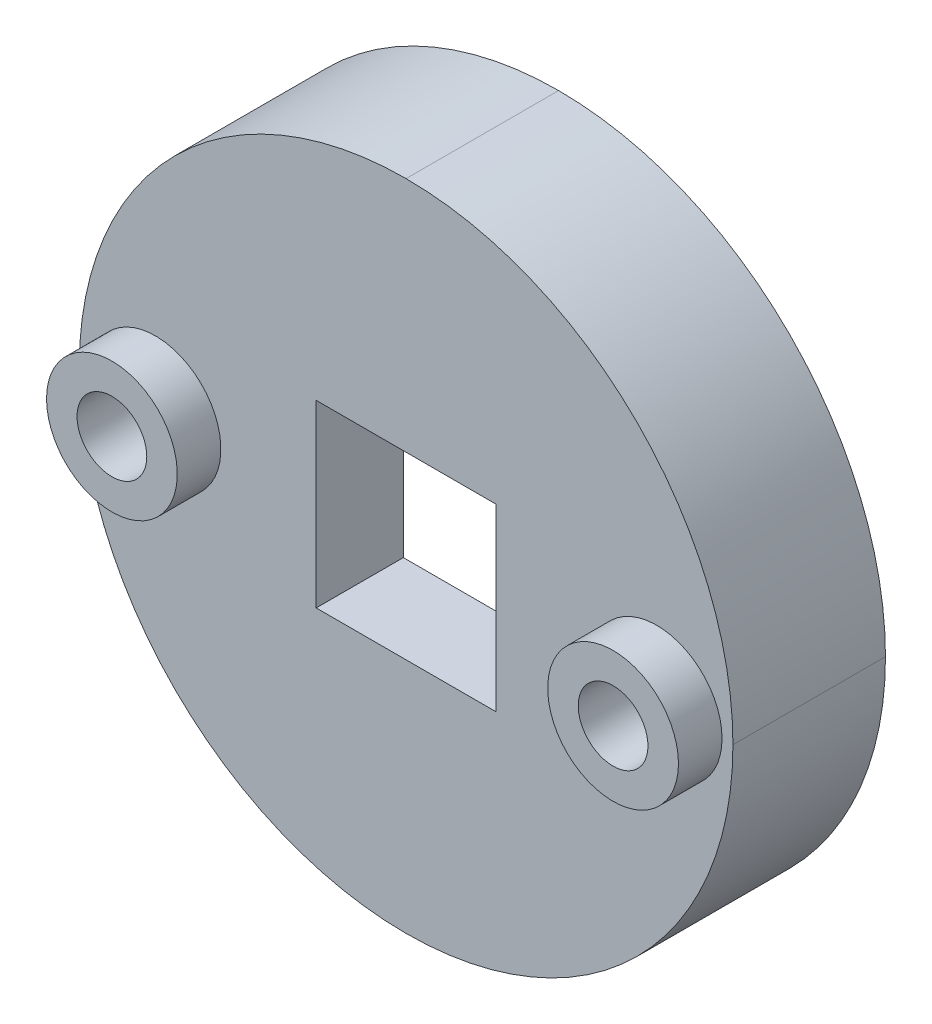
ISO-10303-21;
HEADER;
FILE_DESCRIPTION(('STEP AP214'),'2;1');
FILE_NAME('part.step','',(''),(''),'','','');
FILE_SCHEMA(('AUTOMOTIVE_DESIGN { 1 0 10303 214 1 1 1 1 }'));
ENDSEC;
DATA;
#1=APPLICATION_CONTEXT('core data for automotive mechanical design processes');
#2=APPLICATION_PROTOCOL_DEFINITION('international standard','automotive_design',2000,#1);
#3=PRODUCT_CONTEXT('',#1,'mechanical');
#4=PRODUCT('Part','Part','',(#3));
#5=PRODUCT_RELATED_PRODUCT_CATEGORY('part','',(#4));
#6=PRODUCT_DEFINITION_FORMATION('','',#4);
#7=PRODUCT_DEFINITION_CONTEXT('part definition',#1,'design');
#8=PRODUCT_DEFINITION('design','',#6,#7);
#9=PRODUCT_DEFINITION_SHAPE('','',#8);
#10=(LENGTH_UNIT() NAMED_UNIT(*) SI_UNIT(.MILLI.,.METRE.));
#11=(NAMED_UNIT(*) PLANE_ANGLE_UNIT() SI_UNIT($,.RADIAN.));
#12=(NAMED_UNIT(*) SI_UNIT($,.STERADIAN.) SOLID_ANGLE_UNIT());
#13=UNCERTAINTY_MEASURE_WITH_UNIT(LENGTH_MEASURE(1.E-05),#10,'distance_accuracy_value','');
#14=(GEOMETRIC_REPRESENTATION_CONTEXT(3) GLOBAL_UNCERTAINTY_ASSIGNED_CONTEXT((#13)) GLOBAL_UNIT_ASSIGNED_CONTEXT((#10,
#11,#12)) REPRESENTATION_CONTEXT('',''));
#15=CARTESIAN_POINT('',(0.,0.,0.));
#16=DIRECTION('',(0.,0.,1.));
#17=DIRECTION('',(1.,0.,0.));
#18=AXIS2_PLACEMENT_3D('',#15,#16,#17);
#19=CARTESIAN_POINT('',(4.125,4.125,0.));
#20=DIRECTION('',(1.,0.,0.));
#21=DIRECTION('',(0.,1.,0.));
#22=AXIS2_PLACEMENT_3D('',#19,#20,#21);
#23=PLANE('',#22);
#24=DIRECTION('',(0.,1.,0.));
#25=VECTOR('',#24,1.);
#26=CARTESIAN_POINT('',(4.125,4.125,3.));
#27=LINE('',#26,#25);
#28=CARTESIAN_POINT('',(4.125,-4.125,3.));
#29=VERTEX_POINT('',#28);
#30=CARTESIAN_POINT('',(4.125,4.125,3.));
#31=VERTEX_POINT('',#30);
#32=EDGE_CURVE('E108',#29,#31,#27,.T.);
#33=ORIENTED_EDGE('',*,*,#32,.F.);
#34=DIRECTION('',(0.,0.,1.));
#35=VECTOR('',#34,1.);
#36=CARTESIAN_POINT('',(4.125,-4.125,0.));
#37=LINE('',#36,#35);
#38=CARTESIAN_POINT('',(4.125,-4.125,7.));
#39=VERTEX_POINT('',#38);
#40=EDGE_CURVE('E131',#29,#39,#37,.T.);
#41=ORIENTED_EDGE('',*,*,#40,.T.);
#42=DIRECTION('',(0.,1.,0.));
#43=VECTOR('',#42,1.);
#44=CARTESIAN_POINT('',(4.125,4.125,7.));
#45=LINE('',#44,#43);
#46=CARTESIAN_POINT('',(4.125,4.125,7.));
#47=VERTEX_POINT('',#46);
#48=EDGE_CURVE('E192',#39,#47,#45,.T.);
#49=ORIENTED_EDGE('',*,*,#48,.T.);
#50=DIRECTION('',(0.,0.,1.));
#51=VECTOR('',#50,1.);
#52=CARTESIAN_POINT('',(4.125,4.125,0.));
#53=LINE('',#52,#51);
#54=EDGE_CURVE('E129',#31,#47,#53,.T.);
#55=ORIENTED_EDGE('',*,*,#54,.F.);
#56=EDGE_LOOP('',(#33,#41,#49,#55));
#57=FACE_BOUND('',#56,.T.);
#58=ADVANCED_FACE('F35',(#57),#23,.F.);
#59=CARTESIAN_POINT('',(-4.125,-4.125,0.));
#60=DIRECTION('',(0.,-1.,0.));
#61=DIRECTION('',(0.,0.,-1.));
#62=AXIS2_PLACEMENT_3D('',#59,#60,#61);
#63=PLANE('',#62);
#64=DIRECTION('',(1.,0.,0.));
#65=VECTOR('',#64,1.);
#66=CARTESIAN_POINT('',(-4.125,-4.125,3.));
#67=LINE('',#66,#65);
#68=CARTESIAN_POINT('',(-4.125,-4.125,3.));
#69=VERTEX_POINT('',#68);
#70=EDGE_CURVE('E122',#69,#29,#67,.T.);
#71=ORIENTED_EDGE('',*,*,#70,.F.);
#72=DIRECTION('',(0.,0.,1.));
#73=VECTOR('',#72,1.);
#74=CARTESIAN_POINT('',(-4.125,-4.125,0.));
#75=LINE('',#74,#73);
#76=CARTESIAN_POINT('',(-4.125,-4.125,7.));
#77=VERTEX_POINT('',#76);
#78=EDGE_CURVE('E121',#69,#77,#75,.T.);
#79=ORIENTED_EDGE('',*,*,#78,.T.);
#80=DIRECTION('',(1.,0.,0.));
#81=VECTOR('',#80,1.);
#82=CARTESIAN_POINT('',(-4.125,-4.125,7.));
#83=LINE('',#82,#81);
#84=EDGE_CURVE('E133',#77,#39,#83,.T.);
#85=ORIENTED_EDGE('',*,*,#84,.T.);
#86=ORIENTED_EDGE('',*,*,#40,.F.);
#87=EDGE_LOOP('',(#71,#79,#85,#86));
#88=FACE_BOUND('',#87,.T.);
#89=ADVANCED_FACE('F206',(#88),#63,.F.);
#90=CARTESIAN_POINT('',(-4.125,4.125,0.));
#91=DIRECTION('',(-1.,0.,0.));
#92=DIRECTION('',(0.,-1.,0.));
#93=AXIS2_PLACEMENT_3D('',#90,#91,#92);
#94=PLANE('',#93);
#95=DIRECTION('',(0.,-1.,0.));
#96=VECTOR('',#95,1.);
#97=CARTESIAN_POINT('',(-4.125,4.125,3.));
#98=LINE('',#97,#96);
#99=CARTESIAN_POINT('',(-4.125,4.125,3.));
#100=VERTEX_POINT('',#99);
#101=EDGE_CURVE('E105',#100,#69,#98,.T.);
#102=ORIENTED_EDGE('',*,*,#101,.F.);
#103=DIRECTION('',(0.,0.,1.));
#104=VECTOR('',#103,1.);
#105=CARTESIAN_POINT('',(-4.125,4.125,0.));
#106=LINE('',#105,#104);
#107=CARTESIAN_POINT('',(-4.125,4.125,7.));
#108=VERTEX_POINT('',#107);
#109=EDGE_CURVE('E119',#100,#108,#106,.T.);
#110=ORIENTED_EDGE('',*,*,#109,.T.);
#111=DIRECTION('',(0.,-1.,0.));
#112=VECTOR('',#111,1.);
#113=CARTESIAN_POINT('',(-4.125,4.125,7.));
#114=LINE('',#113,#112);
#115=EDGE_CURVE('E198',#108,#77,#114,.T.);
#116=ORIENTED_EDGE('',*,*,#115,.T.);
#117=ORIENTED_EDGE('',*,*,#78,.F.);
#118=EDGE_LOOP('',(#102,#110,#116,#117));
#119=FACE_BOUND('',#118,.T.);
#120=ADVANCED_FACE('F117',(#119),#94,.F.);
#121=CARTESIAN_POINT('',(-4.125,4.125,0.));
#122=DIRECTION('',(0.,1.,0.));
#123=DIRECTION('',(0.,0.,1.));
#124=AXIS2_PLACEMENT_3D('',#121,#122,#123);
#125=PLANE('',#124);
#126=DIRECTION('',(-1.,0.,0.));
#127=VECTOR('',#126,1.);
#128=CARTESIAN_POINT('',(-4.125,4.125,3.));
#129=LINE('',#128,#127);
#130=EDGE_CURVE('E102',#31,#100,#129,.T.);
#131=ORIENTED_EDGE('',*,*,#130,.F.);
#132=ORIENTED_EDGE('',*,*,#54,.T.);
#133=DIRECTION('',(-1.,0.,0.));
#134=VECTOR('',#133,1.);
#135=CARTESIAN_POINT('',(-4.125,4.125,7.));
#136=LINE('',#135,#134);
#137=EDGE_CURVE('E127',#47,#108,#136,.T.);
#138=ORIENTED_EDGE('',*,*,#137,.T.);
#139=ORIENTED_EDGE('',*,*,#109,.F.);
#140=EDGE_LOOP('',(#131,#132,#138,#139));
#141=FACE_BOUND('',#140,.T.);
#142=ADVANCED_FACE('F125',(#141),#125,.F.);
#143=CARTESIAN_POINT('',(0.,0.,7.));
#144=DIRECTION('',(0.,0.,1.));
#145=DIRECTION('',(1.,0.,0.));
#146=AXIS2_PLACEMENT_3D('',#143,#144,#145);
#147=PLANE('',#146);
#148=CARTESIAN_POINT('',(-11.5,0.,7.));
#149=DIRECTION('',(0.,0.,1.));
#150=DIRECTION('',(-1.,0.,0.));
#151=AXIS2_PLACEMENT_3D('',#148,#149,#150);
#152=CIRCLE('',#151,3.);
#153=CARTESIAN_POINT('',(-14.5,0.,7.));
#154=VERTEX_POINT('',#153);
#155=EDGE_CURVE('E175',#154,#154,#152,.T.);
#156=ORIENTED_EDGE('',*,*,#155,.F.);
#157=EDGE_LOOP('',(#156));
#158=FACE_BOUND('',#157,.T.);
#159=CARTESIAN_POINT('',(11.5,0.,7.));
#160=DIRECTION('',(0.,0.,1.));
#161=DIRECTION('',(1.,0.,0.));
#162=AXIS2_PLACEMENT_3D('',#159,#160,#161);
#163=CIRCLE('',#162,3.);
#164=CARTESIAN_POINT('',(14.5,0.,7.));
#165=VERTEX_POINT('',#164);
#166=EDGE_CURVE('E113',#165,#165,#163,.T.);
#167=ORIENTED_EDGE('',*,*,#166,.F.);
#168=EDGE_LOOP('',(#167));
#169=FACE_BOUND('',#168,.T.);
#170=ORIENTED_EDGE('',*,*,#48,.F.);
#171=ORIENTED_EDGE('',*,*,#84,.F.);
#172=ORIENTED_EDGE('',*,*,#115,.F.);
#173=ORIENTED_EDGE('',*,*,#137,.F.);
#174=EDGE_LOOP('',(#170,#171,#172,#173));
#175=FACE_BOUND('',#174,.T.);
#176=CARTESIAN_POINT('',(0.,0.,7.));
#177=DIRECTION('',(0.,0.,1.));
#178=DIRECTION('',(1.,0.,0.));
#179=AXIS2_PLACEMENT_3D('',#176,#177,#178);
#180=CIRCLE('',#179,15.);
#181=CARTESIAN_POINT('',(15.,0.,7.));
#182=VERTEX_POINT('',#181);
#183=CARTESIAN_POINT('',(0.,15.,7.));
#184=VERTEX_POINT('',#183);
#185=EDGE_CURVE('E44',#182,#184,#180,.T.);
#186=ORIENTED_EDGE('',*,*,#185,.T.);
#187=CARTESIAN_POINT('',(0.,0.,7.));
#188=DIRECTION('',(0.,0.,1.));
#189=DIRECTION('',(1.,0.,0.));
#190=AXIS2_PLACEMENT_3D('',#187,#188,#189);
#191=CIRCLE('',#190,15.);
#192=CARTESIAN_POINT('',(-15.,0.,7.));
#193=VERTEX_POINT('',#192);
#194=EDGE_CURVE('E11',#184,#193,#191,.T.);
#195=ORIENTED_EDGE('',*,*,#194,.T.);
#196=CARTESIAN_POINT('',(0.,0.,7.));
#197=DIRECTION('',(0.,0.,1.));
#198=DIRECTION('',(1.,0.,0.));
#199=AXIS2_PLACEMENT_3D('',#196,#197,#198);
#200=CIRCLE('',#199,15.);
#201=CARTESIAN_POINT('',(0.,-15.,7.));
#202=VERTEX_POINT('',#201);
#203=EDGE_CURVE('E51',#193,#202,#200,.T.);
#204=ORIENTED_EDGE('',*,*,#203,.T.);
#205=CARTESIAN_POINT('',(0.,0.,7.));
#206=DIRECTION('',(0.,0.,1.));
#207=DIRECTION('',(1.,0.,0.));
#208=AXIS2_PLACEMENT_3D('',#205,#206,#207);
#209=CIRCLE('',#208,15.);
#210=EDGE_CURVE('E146',#202,#182,#209,.T.);
#211=ORIENTED_EDGE('',*,*,#210,.T.);
#212=EDGE_LOOP('',(#186,#195,#204,#211));
#213=FACE_BOUND('',#212,.T.);
#214=ADVANCED_FACE('F208',(#158,#169,#175,#213),#147,.T.);
#215=CARTESIAN_POINT('',(0.,0.,0.));
#216=DIRECTION('',(0.,0.,1.));
#217=DIRECTION('',(1.,0.,0.));
#218=AXIS2_PLACEMENT_3D('',#215,#216,#217);
#219=PLANE('',#218);
#220=CARTESIAN_POINT('',(0.,0.,0.));
#221=DIRECTION('',(0.,0.,-1.));
#222=DIRECTION('',(-1.,0.,0.));
#223=AXIS2_PLACEMENT_3D('',#220,#221,#222);
#224=CIRCLE('',#223,12.625);
#225=CARTESIAN_POINT('',(-12.625,0.,0.));
#226=VERTEX_POINT('',#225);
#227=EDGE_CURVE('E157',#226,#226,#224,.T.);
#228=ORIENTED_EDGE('',*,*,#227,.F.);
#229=EDGE_LOOP('',(#228));
#230=FACE_BOUND('',#229,.T.);
#231=CARTESIAN_POINT('',(0.,0.,0.));
#232=DIRECTION('',(0.,0.,1.));
#233=DIRECTION('',(1.,0.,0.));
#234=AXIS2_PLACEMENT_3D('',#231,#232,#233);
#235=CIRCLE('',#234,15.);
#236=CARTESIAN_POINT('',(0.,-15.,0.));
#237=VERTEX_POINT('',#236);
#238=CARTESIAN_POINT('',(-15.,0.,0.));
#239=VERTEX_POINT('',#238);
#240=EDGE_CURVE('E112',#237,#239,#235,.F.);
#241=ORIENTED_EDGE('',*,*,#240,.T.);
#242=CARTESIAN_POINT('',(0.,0.,0.));
#243=DIRECTION('',(0.,0.,1.));
#244=DIRECTION('',(1.,0.,0.));
#245=AXIS2_PLACEMENT_3D('',#242,#243,#244);
#246=CIRCLE('',#245,15.);
#247=CARTESIAN_POINT('',(0.,15.,0.));
#248=VERTEX_POINT('',#247);
#249=EDGE_CURVE('E142',#239,#248,#246,.F.);
#250=ORIENTED_EDGE('',*,*,#249,.T.);
#251=CARTESIAN_POINT('',(0.,0.,0.));
#252=DIRECTION('',(0.,0.,1.));
#253=DIRECTION('',(1.,0.,0.));
#254=AXIS2_PLACEMENT_3D('',#251,#252,#253);
#255=CIRCLE('',#254,15.);
#256=CARTESIAN_POINT('',(15.,0.,0.));
#257=VERTEX_POINT('',#256);
#258=EDGE_CURVE('E140',#248,#257,#255,.F.);
#259=ORIENTED_EDGE('',*,*,#258,.T.);
#260=CARTESIAN_POINT('',(0.,0.,0.));
#261=DIRECTION('',(0.,0.,1.));
#262=DIRECTION('',(1.,0.,0.));
#263=AXIS2_PLACEMENT_3D('',#260,#261,#262);
#264=CIRCLE('',#263,15.);
#265=EDGE_CURVE('E138',#257,#237,#264,.F.);
#266=ORIENTED_EDGE('',*,*,#265,.T.);
#267=EDGE_LOOP('',(#241,#250,#259,#266));
#268=FACE_BOUND('',#267,.T.);
#269=ADVANCED_FACE('F210',(#230,#268),#219,.F.);
#270=CARTESIAN_POINT('',(11.5,0.,9.));
#271=DIRECTION('',(0.,0.,-1.));
#272=DIRECTION('',(-1.,0.,0.));
#273=AXIS2_PLACEMENT_3D('',#270,#271,#272);
#274=CYLINDRICAL_SURFACE('',#273,3.);
#275=CARTESIAN_POINT('',(11.5,0.,9.));
#276=DIRECTION('',(0.,0.,1.));
#277=DIRECTION('',(1.,0.,0.));
#278=AXIS2_PLACEMENT_3D('',#275,#276,#277);
#279=CIRCLE('',#278,3.);
#280=CARTESIAN_POINT('',(14.5,0.,9.));
#281=VERTEX_POINT('',#280);
#282=EDGE_CURVE('E187',#281,#281,#279,.T.);
#283=ORIENTED_EDGE('',*,*,#282,.F.);
#284=EDGE_LOOP('',(#283));
#285=FACE_BOUND('',#284,.T.);
#286=ORIENTED_EDGE('',*,*,#166,.T.);
#287=EDGE_LOOP('',(#286));
#288=FACE_BOUND('',#287,.T.);
#289=ADVANCED_FACE('F233',(#285,#288),#274,.T.);
#290=CARTESIAN_POINT('',(11.5,0.,9.));
#291=DIRECTION('',(0.,0.,1.));
#292=DIRECTION('',(1.,0.,0.));
#293=AXIS2_PLACEMENT_3D('',#290,#291,#292);
#294=PLANE('',#293);
#295=CARTESIAN_POINT('',(11.5,0.,9.));
#296=DIRECTION('',(0.,0.,1.));
#297=DIRECTION('',(1.,0.,0.));
#298=AXIS2_PLACEMENT_3D('',#295,#296,#297);
#299=CIRCLE('',#298,1.6);
#300=CARTESIAN_POINT('',(13.1,0.,9.));
#301=VERTEX_POINT('',#300);
#302=EDGE_CURVE('E171',#301,#301,#299,.T.);
#303=ORIENTED_EDGE('',*,*,#302,.F.);
#304=EDGE_LOOP('',(#303));
#305=FACE_BOUND('',#304,.T.);
#306=ORIENTED_EDGE('',*,*,#282,.T.);
#307=EDGE_LOOP('',(#306));
#308=FACE_BOUND('',#307,.T.);
#309=ADVANCED_FACE('F238',(#305,#308),#294,.T.);
#310=CARTESIAN_POINT('',(-11.5,0.,9.));
#311=DIRECTION('',(0.,0.,-1.));
#312=DIRECTION('',(-1.,0.,0.));
#313=AXIS2_PLACEMENT_3D('',#310,#311,#312);
#314=CYLINDRICAL_SURFACE('',#313,3.);
#315=CARTESIAN_POINT('',(-11.5,0.,9.));
#316=DIRECTION('',(0.,0.,1.));
#317=DIRECTION('',(-1.,0.,0.));
#318=AXIS2_PLACEMENT_3D('',#315,#316,#317);
#319=CIRCLE('',#318,3.);
#320=CARTESIAN_POINT('',(-14.5,0.,9.));
#321=VERTEX_POINT('',#320);
#322=EDGE_CURVE('E184',#321,#321,#319,.T.);
#323=ORIENTED_EDGE('',*,*,#322,.F.);
#324=EDGE_LOOP('',(#323));
#325=FACE_BOUND('',#324,.T.);
#326=ORIENTED_EDGE('',*,*,#155,.T.);
#327=EDGE_LOOP('',(#326));
#328=FACE_BOUND('',#327,.T.);
#329=ADVANCED_FACE('F278',(#325,#328),#314,.T.);
#330=CARTESIAN_POINT('',(-11.5,0.,9.));
#331=DIRECTION('',(0.,0.,-1.));
#332=DIRECTION('',(-1.,0.,0.));
#333=AXIS2_PLACEMENT_3D('',#330,#331,#332);
#334=PLANE('',#333);
#335=CARTESIAN_POINT('',(-11.5,0.,9.));
#336=DIRECTION('',(0.,0.,1.));
#337=DIRECTION('',(1.,0.,0.));
#338=AXIS2_PLACEMENT_3D('',#335,#336,#337);
#339=CIRCLE('',#338,1.6);
#340=CARTESIAN_POINT('',(-9.9,0.,9.));
#341=VERTEX_POINT('',#340);
#342=EDGE_CURVE('E176',#341,#341,#339,.T.);
#343=ORIENTED_EDGE('',*,*,#342,.F.);
#344=EDGE_LOOP('',(#343));
#345=FACE_BOUND('',#344,.T.);
#346=ORIENTED_EDGE('',*,*,#322,.T.);
#347=EDGE_LOOP('',(#346));
#348=FACE_BOUND('',#347,.T.);
#349=ADVANCED_FACE('F268',(#345,#348),#334,.F.);
#350=CARTESIAN_POINT('',(-11.5,0.,4.));
#351=DIRECTION('',(0.,0.,1.));
#352=DIRECTION('',(1.,0.,0.));
#353=AXIS2_PLACEMENT_3D('',#350,#351,#352);
#354=CYLINDRICAL_SURFACE('',#353,1.6);
#355=CARTESIAN_POINT('',(-11.5,0.,4.));
#356=DIRECTION('',(0.,0.,1.));
#357=DIRECTION('',(1.,0.,0.));
#358=AXIS2_PLACEMENT_3D('',#355,#356,#357);
#359=CIRCLE('',#358,1.6);
#360=CARTESIAN_POINT('',(-9.9,0.,4.));
#361=VERTEX_POINT('',#360);
#362=EDGE_CURVE('E172',#361,#361,#359,.T.);
#363=ORIENTED_EDGE('',*,*,#362,.F.);
#364=EDGE_LOOP('',(#363));
#365=FACE_BOUND('',#364,.T.);
#366=ORIENTED_EDGE('',*,*,#342,.T.);
#367=EDGE_LOOP('',(#366));
#368=FACE_BOUND('',#367,.T.);
#369=ADVANCED_FACE('F264',(#365,#368),#354,.F.);
#370=CARTESIAN_POINT('',(-11.5,0.,4.));
#371=DIRECTION('',(0.,0.,1.));
#372=DIRECTION('',(1.,0.,0.));
#373=AXIS2_PLACEMENT_3D('',#370,#371,#372);
#374=PLANE('',#373);
#375=ORIENTED_EDGE('',*,*,#362,.T.);
#376=EDGE_LOOP('',(#375));
#377=FACE_BOUND('',#376,.T.);
#378=ADVANCED_FACE('F260',(#377),#374,.T.);
#379=CARTESIAN_POINT('',(11.5,0.,4.));
#380=DIRECTION('',(0.,0.,1.));
#381=DIRECTION('',(1.,0.,0.));
#382=AXIS2_PLACEMENT_3D('',#379,#380,#381);
#383=CYLINDRICAL_SURFACE('',#382,1.6);
#384=CARTESIAN_POINT('',(11.5,0.,4.));
#385=DIRECTION('',(0.,0.,1.));
#386=DIRECTION('',(1.,0.,0.));
#387=AXIS2_PLACEMENT_3D('',#384,#385,#386);
#388=CIRCLE('',#387,1.6);
#389=CARTESIAN_POINT('',(13.1,0.,4.));
#390=VERTEX_POINT('',#389);
#391=EDGE_CURVE('E179',#390,#390,#388,.T.);
#392=ORIENTED_EDGE('',*,*,#391,.F.);
#393=EDGE_LOOP('',(#392));
#394=FACE_BOUND('',#393,.T.);
#395=ORIENTED_EDGE('',*,*,#302,.T.);
#396=EDGE_LOOP('',(#395));
#397=FACE_BOUND('',#396,.T.);
#398=ADVANCED_FACE('F263',(#394,#397),#383,.F.);
#399=CARTESIAN_POINT('',(11.5,0.,4.));
#400=DIRECTION('',(0.,0.,1.));
#401=DIRECTION('',(1.,0.,0.));
#402=AXIS2_PLACEMENT_3D('',#399,#400,#401);
#403=PLANE('',#402);
#404=ORIENTED_EDGE('',*,*,#391,.T.);
#405=EDGE_LOOP('',(#404));
#406=FACE_BOUND('',#405,.T.);
#407=ADVANCED_FACE('F255',(#406),#403,.T.);
#408=CARTESIAN_POINT('',(0.,0.,3.));
#409=DIRECTION('',(0.,0.,-1.));
#410=DIRECTION('',(-1.,0.,0.));
#411=AXIS2_PLACEMENT_3D('',#408,#409,#410);
#412=PLANE('',#411);
#413=CARTESIAN_POINT('',(0.,0.,3.));
#414=DIRECTION('',(0.,0.,-1.));
#415=DIRECTION('',(-1.,0.,0.));
#416=AXIS2_PLACEMENT_3D('',#413,#414,#415);
#417=CIRCLE('',#416,12.625);
#418=CARTESIAN_POINT('',(-12.625,0.,3.));
#419=VERTEX_POINT('',#418);
#420=EDGE_CURVE('E123',#419,#419,#417,.T.);
#421=ORIENTED_EDGE('',*,*,#420,.T.);
#422=EDGE_LOOP('',(#421));
#423=FACE_BOUND('',#422,.T.);
#424=ORIENTED_EDGE('',*,*,#32,.T.);
#425=ORIENTED_EDGE('',*,*,#130,.T.);
#426=ORIENTED_EDGE('',*,*,#101,.T.);
#427=ORIENTED_EDGE('',*,*,#70,.T.);
#428=EDGE_LOOP('',(#424,#425,#426,#427));
#429=FACE_BOUND('',#428,.T.);
#430=ADVANCED_FACE('F104',(#423,#429),#412,.T.);
#431=CARTESIAN_POINT('',(0.,0.,3.));
#432=DIRECTION('',(0.,0.,-1.));
#433=DIRECTION('',(-1.,0.,0.));
#434=AXIS2_PLACEMENT_3D('',#431,#432,#433);
#435=CYLINDRICAL_SURFACE('',#434,12.625);
#436=ORIENTED_EDGE('',*,*,#420,.F.);
#437=EDGE_LOOP('',(#436));
#438=FACE_BOUND('',#437,.T.);
#439=ORIENTED_EDGE('',*,*,#227,.T.);
#440=EDGE_LOOP('',(#439));
#441=FACE_BOUND('',#440,.T.);
#442=ADVANCED_FACE('F245',(#438,#441),#435,.F.);
#443=CARTESIAN_POINT('',(0.,0.,7.));
#444=DIRECTION('',(0.,0.,-1.));
#445=DIRECTION('',(-1.,0.,0.));
#446=AXIS2_PLACEMENT_3D('',#443,#444,#445);
#447=CYLINDRICAL_SURFACE('',#446,15.);
#448=DIRECTION('',(0.,0.,-1.));
#449=VECTOR('',#448,1.);
#450=CARTESIAN_POINT('',(0.,-15.,7.));
#451=LINE('',#450,#449);
#452=EDGE_CURVE('E151',#237,#202,#451,.F.);
#453=ORIENTED_EDGE('',*,*,#452,.F.);
#454=ORIENTED_EDGE('',*,*,#265,.F.);
#455=DIRECTION('',(0.,0.,-1.));
#456=VECTOR('',#455,1.);
#457=CARTESIAN_POINT('',(15.,0.,7.));
#458=LINE('',#457,#456);
#459=EDGE_CURVE('E39',#182,#257,#458,.T.);
#460=ORIENTED_EDGE('',*,*,#459,.F.);
#461=ORIENTED_EDGE('',*,*,#210,.F.);
#462=EDGE_LOOP('',(#453,#454,#460,#461));
#463=FACE_BOUND('',#462,.T.);
#464=ADVANCED_FACE('F37',(#463),#447,.T.);
#465=CARTESIAN_POINT('',(0.,0.,7.));
#466=DIRECTION('',(0.,0.,-1.));
#467=DIRECTION('',(-1.,0.,0.));
#468=AXIS2_PLACEMENT_3D('',#465,#466,#467);
#469=CYLINDRICAL_SURFACE('',#468,15.);
#470=ORIENTED_EDGE('',*,*,#459,.T.);
#471=ORIENTED_EDGE('',*,*,#258,.F.);
#472=DIRECTION('',(0.,0.,-1.));
#473=VECTOR('',#472,1.);
#474=CARTESIAN_POINT('',(0.,15.,7.));
#475=LINE('',#474,#473);
#476=EDGE_CURVE('E150',#184,#248,#475,.T.);
#477=ORIENTED_EDGE('',*,*,#476,.F.);
#478=ORIENTED_EDGE('',*,*,#185,.F.);
#479=EDGE_LOOP('',(#470,#471,#477,#478));
#480=FACE_BOUND('',#479,.T.);
#481=ADVANCED_FACE('F214',(#480),#469,.T.);
#482=CARTESIAN_POINT('',(0.,0.,7.));
#483=DIRECTION('',(0.,0.,-1.));
#484=DIRECTION('',(-1.,0.,0.));
#485=AXIS2_PLACEMENT_3D('',#482,#483,#484);
#486=CYLINDRICAL_SURFACE('',#485,15.);
#487=ORIENTED_EDGE('',*,*,#452,.T.);
#488=ORIENTED_EDGE('',*,*,#203,.F.);
#489=DIRECTION('',(0.,0.,-1.));
#490=VECTOR('',#489,1.);
#491=CARTESIAN_POINT('',(-15.,0.,7.));
#492=LINE('',#491,#490);
#493=EDGE_CURVE('E59',#239,#193,#492,.F.);
#494=ORIENTED_EDGE('',*,*,#493,.F.);
#495=ORIENTED_EDGE('',*,*,#240,.F.);
#496=EDGE_LOOP('',(#487,#488,#494,#495));
#497=FACE_BOUND('',#496,.T.);
#498=ADVANCED_FACE('F217',(#497),#486,.T.);
#499=CARTESIAN_POINT('',(0.,0.,7.));
#500=DIRECTION('',(0.,0.,-1.));
#501=DIRECTION('',(-1.,0.,0.));
#502=AXIS2_PLACEMENT_3D('',#499,#500,#501);
#503=CYLINDRICAL_SURFACE('',#502,15.);
#504=ORIENTED_EDGE('',*,*,#194,.F.);
#505=ORIENTED_EDGE('',*,*,#476,.T.);
#506=ORIENTED_EDGE('',*,*,#249,.F.);
#507=ORIENTED_EDGE('',*,*,#493,.T.);
#508=EDGE_LOOP('',(#504,#505,#506,#507));
#509=FACE_BOUND('',#508,.T.);
#510=ADVANCED_FACE('F215',(#509),#503,.T.);
#511=CLOSED_SHELL('',(#58,#89,#120,#142,#214,#269,#289,#309,#329,#349,#369,#378,#398,#407,#430,
#442,#464,#481,#498,#510));
#512=MANIFOLD_SOLID_BREP('B2',#511);
#513=ADVANCED_BREP_SHAPE_REPRESENTATION('',(#18,#512),#14);
#514=SHAPE_DEFINITION_REPRESENTATION(#9,#513);
ENDSEC;
END-ISO-10303-21;
